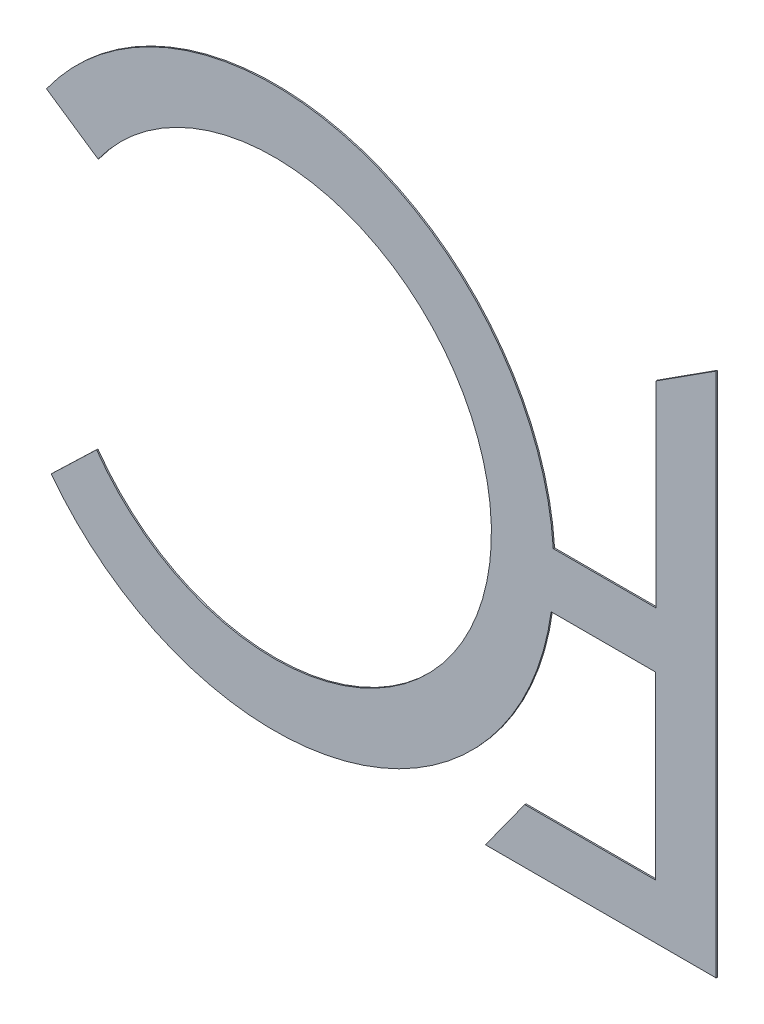
ISO-10303-21;
HEADER;
FILE_DESCRIPTION(('STEP AP214'),'2;1');
FILE_NAME('part.step','',(''),(''),'','','');
FILE_SCHEMA(('AUTOMOTIVE_DESIGN { 1 0 10303 214 1 1 1 1 }'));
ENDSEC;
DATA;
#1=APPLICATION_CONTEXT('core data for automotive mechanical design processes');
#2=APPLICATION_PROTOCOL_DEFINITION('international standard','automotive_design',2000,#1);
#3=PRODUCT_CONTEXT('',#1,'mechanical');
#4=PRODUCT('Part','Part','',(#3));
#5=PRODUCT_RELATED_PRODUCT_CATEGORY('part','',(#4));
#6=PRODUCT_DEFINITION_FORMATION('','',#4);
#7=PRODUCT_DEFINITION_CONTEXT('part definition',#1,'design');
#8=PRODUCT_DEFINITION('design','',#6,#7);
#9=PRODUCT_DEFINITION_SHAPE('','',#8);
#10=(LENGTH_UNIT() NAMED_UNIT(*) SI_UNIT(.MILLI.,.METRE.));
#11=(NAMED_UNIT(*) PLANE_ANGLE_UNIT() SI_UNIT($,.RADIAN.));
#12=(NAMED_UNIT(*) SI_UNIT($,.STERADIAN.) SOLID_ANGLE_UNIT());
#13=UNCERTAINTY_MEASURE_WITH_UNIT(LENGTH_MEASURE(1.E-05),#10,'distance_accuracy_value','');
#14=(GEOMETRIC_REPRESENTATION_CONTEXT(3) GLOBAL_UNCERTAINTY_ASSIGNED_CONTEXT((#13)) GLOBAL_UNIT_ASSIGNED_CONTEXT((#10,
#11,#12)) REPRESENTATION_CONTEXT('',''));
#15=CARTESIAN_POINT('',(0.,0.,0.));
#16=DIRECTION('',(0.,0.,1.));
#17=DIRECTION('',(1.,0.,0.));
#18=AXIS2_PLACEMENT_3D('',#15,#16,#17);
#19=CARTESIAN_POINT('',(3.323569875861,-23.78594416099,0.01));
#20=DIRECTION('',(0.,0.,1.));
#21=DIRECTION('',(1.,0.,0.));
#22=AXIS2_PLACEMENT_3D('',#19,#20,#21);
#23=PLANE('',#22);
#24=DIRECTION('',(-1.,0.,0.));
#25=VECTOR('',#24,1.);
#26=CARTESIAN_POINT('',(4.931794,-23.46396900002,0.01));
#27=LINE('',#26,#25);
#28=CARTESIAN_POINT('',(4.931794,-23.46396900002,0.01));
#29=VERTEX_POINT('',#28);
#30=CARTESIAN_POINT('',(4.146773989456,-23.46396900002,0.01));
#31=VERTEX_POINT('',#30);
#32=EDGE_CURVE('E408',#29,#31,#27,.T.);
#33=ORIENTED_EDGE('',*,*,#32,.T.);
#34=CARTESIAN_POINT('',(2.014560027913,-23.5982645729,0.01));
#35=DIRECTION('',(0.,0.,1.));
#36=DIRECTION('',(1.,0.,0.));
#37=AXIS2_PLACEMENT_3D('',#34,#35,#36);
#38=CIRCLE('',#37,2.136439018248);
#39=CARTESIAN_POINT('',(0.275233743911,-22.35765353132,0.01));
#40=VERTEX_POINT('',#39);
#41=EDGE_CURVE('E11',#31,#40,#38,.T.);
#42=ORIENTED_EDGE('',*,*,#41,.T.);
#43=DIRECTION('',(0.827164937117005,-0.561959221656003,0.));
#44=VECTOR('',#43,1.);
#45=CARTESIAN_POINT('',(0.275233743911,-22.35765353132,0.01));
#46=LINE('',#45,#44);
#47=CARTESIAN_POINT('',(0.669691577678,-22.62564024993,0.01));
#48=VERTEX_POINT('',#47);
#49=EDGE_CURVE('E221',#40,#48,#46,.T.);
#50=ORIENTED_EDGE('',*,*,#49,.T.);
#51=CARTESIAN_POINT('',(2.014560027913,-23.5982645729,0.01));
#52=DIRECTION('',(0.,0.,1.));
#53=DIRECTION('',(1.,0.,0.));
#54=AXIS2_PLACEMENT_3D('',#51,#52,#53);
#55=CIRCLE('',#54,1.659719621524);
#56=CARTESIAN_POINT('',(0.657803128342,-24.55423525108,0.01));
#57=VERTEX_POINT('',#56);
#58=EDGE_CURVE('E228',#57,#48,#55,.T.);
#59=ORIENTED_EDGE('',*,*,#58,.F.);
#60=DIRECTION('',(0.720954387731231,0.692982518402222,0.));
#61=VECTOR('',#60,1.);
#62=CARTESIAN_POINT('',(0.311014787722,-24.88756876249,0.01));
#63=LINE('',#62,#61);
#64=CARTESIAN_POINT('',(0.311014787722,-24.88756876249,0.01));
#65=VERTEX_POINT('',#64);
#66=EDGE_CURVE('E217',#65,#57,#63,.T.);
#67=ORIENTED_EDGE('',*,*,#66,.F.);
#68=CARTESIAN_POINT('',(2.014560027913,-23.5982645729,0.01));
#69=DIRECTION('',(0.,0.,1.));
#70=DIRECTION('',(1.,0.,0.));
#71=AXIS2_PLACEMENT_3D('',#68,#69,#70);
#72=CIRCLE('',#71,2.136439018248);
#73=CARTESIAN_POINT('',(4.13101029711,-23.88982920845,0.01));
#74=VERTEX_POINT('',#73);
#75=EDGE_CURVE('E214',#65,#74,#72,.T.);
#76=ORIENTED_EDGE('',*,*,#75,.T.);
#77=DIRECTION('',(-1.,0.,0.));
#78=VECTOR('',#77,1.);
#79=CARTESIAN_POINT('',(4.927378,-23.88982920845,0.01));
#80=LINE('',#79,#78);
#81=CARTESIAN_POINT('',(4.927378,-23.88982920845,0.01));
#82=VERTEX_POINT('',#81);
#83=EDGE_CURVE('E194',#82,#74,#80,.T.);
#84=ORIENTED_EDGE('',*,*,#83,.F.);
#85=DIRECTION('',(0.,1.,0.));
#86=VECTOR('',#85,1.);
#87=CARTESIAN_POINT('',(4.927378,-25.266255,0.01));
#88=LINE('',#87,#86);
#89=CARTESIAN_POINT('',(4.927378,-25.266255,0.01));
#90=VERTEX_POINT('',#89);
#91=EDGE_CURVE('E154',#90,#82,#88,.T.);
#92=ORIENTED_EDGE('',*,*,#91,.F.);
#93=DIRECTION('',(1.,0.,0.));
#94=VECTOR('',#93,1.);
#95=CARTESIAN_POINT('',(3.929058,-25.266255,0.01));
#96=LINE('',#95,#94);
#97=CARTESIAN_POINT('',(3.929058,-25.266255,0.01));
#98=VERTEX_POINT('',#97);
#99=EDGE_CURVE('E148',#98,#90,#96,.T.);
#100=ORIENTED_EDGE('',*,*,#99,.F.);
#101=DIRECTION('',(0.585300402101743,0.810816526286643,0.));
#102=VECTOR('',#101,1.);
#103=CARTESIAN_POINT('',(3.628518,-25.682593,0.01));
#104=LINE('',#103,#102);
#105=CARTESIAN_POINT('',(3.628518,-25.682593,0.01));
#106=VERTEX_POINT('',#105);
#107=EDGE_CURVE('E151',#106,#98,#104,.T.);
#108=ORIENTED_EDGE('',*,*,#107,.F.);
#109=DIRECTION('',(-1.,0.,0.));
#110=VECTOR('',#109,1.);
#111=CARTESIAN_POINT('',(5.391386,-25.682593,0.01));
#112=LINE('',#111,#110);
#113=CARTESIAN_POINT('',(5.391386,-25.682593,0.01));
#114=VERTEX_POINT('',#113);
#115=EDGE_CURVE('E467',#114,#106,#112,.T.);
#116=ORIENTED_EDGE('',*,*,#115,.F.);
#117=DIRECTION('',(0.,-1.,0.));
#118=VECTOR('',#117,1.);
#119=CARTESIAN_POINT('',(5.391386,-21.666679,0.01));
#120=LINE('',#119,#118);
#121=CARTESIAN_POINT('',(5.391386,-21.666679,0.01));
#122=VERTEX_POINT('',#121);
#123=EDGE_CURVE('E452',#122,#114,#120,.T.);
#124=ORIENTED_EDGE('',*,*,#123,.F.);
#125=DIRECTION('',(-0.841324165024407,-0.540530895829262,0.));
#126=VECTOR('',#125,1.);
#127=CARTESIAN_POINT('',(5.391386,-21.666679,0.01));
#128=LINE('',#127,#126);
#129=CARTESIAN_POINT('',(4.931794,-21.961956,0.01));
#130=VERTEX_POINT('',#129);
#131=EDGE_CURVE('E428',#122,#130,#128,.T.);
#132=ORIENTED_EDGE('',*,*,#131,.T.);
#133=DIRECTION('',(0.,-1.,0.));
#134=VECTOR('',#133,1.);
#135=CARTESIAN_POINT('',(4.931794,-21.961956,0.01));
#136=LINE('',#135,#134);
#137=EDGE_CURVE('E410',#130,#29,#136,.T.);
#138=ORIENTED_EDGE('',*,*,#137,.T.);
#139=EDGE_LOOP('',(#33,#42,#50,#59,#67,#76,#84,#92,#100,#108,#116,#124,#132,#138));
#140=FACE_BOUND('',#139,.T.);
#141=ADVANCED_FACE('F17',(#140),#23,.T.);
#142=CARTESIAN_POINT('',(3.323569875861,-23.78594416099,0.));
#143=DIRECTION('',(0.,0.,1.));
#144=DIRECTION('',(1.,0.,0.));
#145=AXIS2_PLACEMENT_3D('',#142,#143,#144);
#146=PLANE('',#145);
#147=DIRECTION('',(-1.,0.,0.));
#148=VECTOR('',#147,1.);
#149=CARTESIAN_POINT('',(4.931794,-23.46396900002,0.));
#150=LINE('',#149,#148);
#151=CARTESIAN_POINT('',(4.931794,-23.46396900002,0.));
#152=VERTEX_POINT('',#151);
#153=CARTESIAN_POINT('',(4.146773989456,-23.46396900002,0.));
#154=VERTEX_POINT('',#153);
#155=EDGE_CURVE('E417',#152,#154,#150,.T.);
#156=ORIENTED_EDGE('',*,*,#155,.F.);
#157=DIRECTION('',(0.,-1.,0.));
#158=VECTOR('',#157,1.);
#159=CARTESIAN_POINT('',(4.931794,-21.961956,0.));
#160=LINE('',#159,#158);
#161=CARTESIAN_POINT('',(4.931794,-21.961956,0.));
#162=VERTEX_POINT('',#161);
#163=EDGE_CURVE('E437',#162,#152,#160,.T.);
#164=ORIENTED_EDGE('',*,*,#163,.F.);
#165=DIRECTION('',(-0.841324165024407,-0.540530895829262,0.));
#166=VECTOR('',#165,1.);
#167=CARTESIAN_POINT('',(5.391386,-21.666679,0.));
#168=LINE('',#167,#166);
#169=CARTESIAN_POINT('',(5.391386,-21.666679,0.));
#170=VERTEX_POINT('',#169);
#171=EDGE_CURVE('E438',#170,#162,#168,.T.);
#172=ORIENTED_EDGE('',*,*,#171,.F.);
#173=DIRECTION('',(0.,-1.,0.));
#174=VECTOR('',#173,1.);
#175=CARTESIAN_POINT('',(5.391386,-21.666679,0.));
#176=LINE('',#175,#174);
#177=CARTESIAN_POINT('',(5.391386,-25.682593,0.));
#178=VERTEX_POINT('',#177);
#179=EDGE_CURVE('E464',#170,#178,#176,.T.);
#180=ORIENTED_EDGE('',*,*,#179,.T.);
#181=DIRECTION('',(-1.,0.,0.));
#182=VECTOR('',#181,1.);
#183=CARTESIAN_POINT('',(5.391386,-25.682593,0.));
#184=LINE('',#183,#182);
#185=CARTESIAN_POINT('',(3.628518,-25.682593,0.));
#186=VERTEX_POINT('',#185);
#187=EDGE_CURVE('E176',#178,#186,#184,.T.);
#188=ORIENTED_EDGE('',*,*,#187,.T.);
#189=DIRECTION('',(0.585300402101743,0.810816526286643,0.));
#190=VECTOR('',#189,1.);
#191=CARTESIAN_POINT('',(3.628518,-25.682593,0.));
#192=LINE('',#191,#190);
#193=CARTESIAN_POINT('',(3.929058,-25.266255,0.));
#194=VERTEX_POINT('',#193);
#195=EDGE_CURVE('E160',#186,#194,#192,.T.);
#196=ORIENTED_EDGE('',*,*,#195,.T.);
#197=DIRECTION('',(1.,0.,0.));
#198=VECTOR('',#197,1.);
#199=CARTESIAN_POINT('',(3.929058,-25.266255,0.));
#200=LINE('',#199,#198);
#201=CARTESIAN_POINT('',(4.927378,-25.266255,0.));
#202=VERTEX_POINT('',#201);
#203=EDGE_CURVE('E166',#194,#202,#200,.T.);
#204=ORIENTED_EDGE('',*,*,#203,.T.);
#205=DIRECTION('',(0.,1.,0.));
#206=VECTOR('',#205,1.);
#207=CARTESIAN_POINT('',(4.927378,-25.266255,0.));
#208=LINE('',#207,#206);
#209=CARTESIAN_POINT('',(4.927378,-23.88982920845,0.));
#210=VERTEX_POINT('',#209);
#211=EDGE_CURVE('E190',#202,#210,#208,.T.);
#212=ORIENTED_EDGE('',*,*,#211,.T.);
#213=DIRECTION('',(-1.,0.,0.));
#214=VECTOR('',#213,1.);
#215=CARTESIAN_POINT('',(4.927378,-23.88982920845,0.));
#216=LINE('',#215,#214);
#217=CARTESIAN_POINT('',(4.13101029711,-23.88982920845,0.));
#218=VERTEX_POINT('',#217);
#219=EDGE_CURVE('E203',#210,#218,#216,.T.);
#220=ORIENTED_EDGE('',*,*,#219,.T.);
#221=CARTESIAN_POINT('',(2.014560027913,-23.5982645729,0.));
#222=DIRECTION('',(0.,0.,1.));
#223=DIRECTION('',(1.,0.,0.));
#224=AXIS2_PLACEMENT_3D('',#221,#222,#223);
#225=CIRCLE('',#224,2.136439018248);
#226=CARTESIAN_POINT('',(0.311014787722,-24.88756876249,0.));
#227=VERTEX_POINT('',#226);
#228=EDGE_CURVE('E211',#227,#218,#225,.T.);
#229=ORIENTED_EDGE('',*,*,#228,.F.);
#230=DIRECTION('',(0.720954387731231,0.692982518402222,0.));
#231=VECTOR('',#230,1.);
#232=CARTESIAN_POINT('',(0.311014787722,-24.88756876249,0.));
#233=LINE('',#232,#231);
#234=CARTESIAN_POINT('',(0.657803128342,-24.55423525108,0.));
#235=VERTEX_POINT('',#234);
#236=EDGE_CURVE('E227',#227,#235,#233,.T.);
#237=ORIENTED_EDGE('',*,*,#236,.T.);
#238=CARTESIAN_POINT('',(2.014560027913,-23.5982645729,0.));
#239=DIRECTION('',(0.,0.,1.));
#240=DIRECTION('',(1.,0.,0.));
#241=AXIS2_PLACEMENT_3D('',#238,#239,#240);
#242=CIRCLE('',#241,1.659719621524);
#243=CARTESIAN_POINT('',(0.669691577678,-22.62564024993,0.));
#244=VERTEX_POINT('',#243);
#245=EDGE_CURVE('E236',#235,#244,#242,.T.);
#246=ORIENTED_EDGE('',*,*,#245,.T.);
#247=DIRECTION('',(0.827164937117005,-0.561959221656003,0.));
#248=VECTOR('',#247,1.);
#249=CARTESIAN_POINT('',(0.275233743911,-22.35765353132,0.));
#250=LINE('',#249,#248);
#251=CARTESIAN_POINT('',(0.275233743911,-22.35765353132,0.));
#252=VERTEX_POINT('',#251);
#253=EDGE_CURVE('E218',#252,#244,#250,.T.);
#254=ORIENTED_EDGE('',*,*,#253,.F.);
#255=CARTESIAN_POINT('',(2.014560027913,-23.5982645729,0.));
#256=DIRECTION('',(0.,0.,1.));
#257=DIRECTION('',(1.,0.,0.));
#258=AXIS2_PLACEMENT_3D('',#255,#256,#257);
#259=CIRCLE('',#258,2.136439018248);
#260=EDGE_CURVE('E25',#154,#252,#259,.T.);
#261=ORIENTED_EDGE('',*,*,#260,.F.);
#262=EDGE_LOOP('',(#156,#164,#172,#180,#188,#196,#204,#212,#220,#229,#237,#246,#254,#261));
#263=FACE_BOUND('',#262,.T.);
#264=ADVANCED_FACE('F291',(#263),#146,.F.);
#265=CARTESIAN_POINT('',(2.014560027913,-23.5982645729,0.));
#266=DIRECTION('',(0.,0.,-1.));
#267=DIRECTION('',(1.,0.,0.));
#268=AXIS2_PLACEMENT_3D('',#265,#266,#267);
#269=CYLINDRICAL_SURFACE('',#268,2.136439018248);
#270=DIRECTION('',(0.,0.,1.));
#271=VECTOR('',#270,1.);
#272=CARTESIAN_POINT('',(4.146773989456,-23.46396900002,0.));
#273=LINE('',#272,#271);
#274=EDGE_CURVE('E405',#154,#31,#273,.T.);
#275=ORIENTED_EDGE('',*,*,#274,.F.);
#276=ORIENTED_EDGE('',*,*,#260,.T.);
#277=DIRECTION('',(0.,0.,1.));
#278=VECTOR('',#277,1.);
#279=CARTESIAN_POINT('',(0.275233743911,-22.35765353132,0.));
#280=LINE('',#279,#278);
#281=EDGE_CURVE('E222',#252,#40,#280,.T.);
#282=ORIENTED_EDGE('',*,*,#281,.T.);
#283=ORIENTED_EDGE('',*,*,#41,.F.);
#284=EDGE_LOOP('',(#275,#276,#282,#283));
#285=FACE_BOUND('',#284,.T.);
#286=ADVANCED_FACE('F296',(#285),#269,.T.);
#287=CARTESIAN_POINT('',(0.275233743911,-22.35765353132,0.));
#288=DIRECTION('',(0.561959221656003,0.827164937117005,0.));
#289=DIRECTION('',(0.,0.,-1.));
#290=AXIS2_PLACEMENT_3D('',#287,#288,#289);
#291=PLANE('',#290);
#292=ORIENTED_EDGE('',*,*,#281,.F.);
#293=ORIENTED_EDGE('',*,*,#253,.T.);
#294=DIRECTION('',(0.,0.,1.));
#295=VECTOR('',#294,1.);
#296=CARTESIAN_POINT('',(0.669691577678,-22.62564024993,0.));
#297=LINE('',#296,#295);
#298=EDGE_CURVE('E232',#244,#48,#297,.T.);
#299=ORIENTED_EDGE('',*,*,#298,.T.);
#300=ORIENTED_EDGE('',*,*,#49,.F.);
#301=EDGE_LOOP('',(#292,#293,#299,#300));
#302=FACE_BOUND('',#301,.T.);
#303=ADVANCED_FACE('F322',(#302),#291,.F.);
#304=CARTESIAN_POINT('',(2.014560027913,-23.5982645729,0.));
#305=DIRECTION('',(0.,0.,-1.));
#306=DIRECTION('',(1.,0.,0.));
#307=AXIS2_PLACEMENT_3D('',#304,#305,#306);
#308=CYLINDRICAL_SURFACE('',#307,1.659719621524);
#309=DIRECTION('',(0.,0.,1.));
#310=VECTOR('',#309,1.);
#311=CARTESIAN_POINT('',(0.657803128342,-24.55423525108,0.));
#312=LINE('',#311,#310);
#313=EDGE_CURVE('E223',#235,#57,#312,.T.);
#314=ORIENTED_EDGE('',*,*,#313,.T.);
#315=ORIENTED_EDGE('',*,*,#58,.T.);
#316=ORIENTED_EDGE('',*,*,#298,.F.);
#317=ORIENTED_EDGE('',*,*,#245,.F.);
#318=EDGE_LOOP('',(#314,#315,#316,#317));
#319=FACE_BOUND('',#318,.T.);
#320=ADVANCED_FACE('F253',(#319),#308,.F.);
#321=CARTESIAN_POINT('',(0.311014787722,-24.88756876249,0.));
#322=DIRECTION('',(-0.692982518402222,0.720954387731231,0.));
#323=DIRECTION('',(0.,0.,1.));
#324=AXIS2_PLACEMENT_3D('',#321,#322,#323);
#325=PLANE('',#324);
#326=DIRECTION('',(0.,0.,1.));
#327=VECTOR('',#326,1.);
#328=CARTESIAN_POINT('',(0.311014787722,-24.88756876249,0.));
#329=LINE('',#328,#327);
#330=EDGE_CURVE('E207',#227,#65,#329,.T.);
#331=ORIENTED_EDGE('',*,*,#330,.T.);
#332=ORIENTED_EDGE('',*,*,#66,.T.);
#333=ORIENTED_EDGE('',*,*,#313,.F.);
#334=ORIENTED_EDGE('',*,*,#236,.F.);
#335=EDGE_LOOP('',(#331,#332,#333,#334));
#336=FACE_BOUND('',#335,.T.);
#337=ADVANCED_FACE('F247',(#336),#325,.T.);
#338=CARTESIAN_POINT('',(2.014560027913,-23.5982645729,0.));
#339=DIRECTION('',(0.,0.,-1.));
#340=DIRECTION('',(1.,0.,0.));
#341=AXIS2_PLACEMENT_3D('',#338,#339,#340);
#342=CYLINDRICAL_SURFACE('',#341,2.136439018248);
#343=ORIENTED_EDGE('',*,*,#330,.F.);
#344=ORIENTED_EDGE('',*,*,#228,.T.);
#345=DIRECTION('',(0.,0.,1.));
#346=VECTOR('',#345,1.);
#347=CARTESIAN_POINT('',(4.13101029711,-23.88982920845,0.));
#348=LINE('',#347,#346);
#349=EDGE_CURVE('E199',#218,#74,#348,.T.);
#350=ORIENTED_EDGE('',*,*,#349,.T.);
#351=ORIENTED_EDGE('',*,*,#75,.F.);
#352=EDGE_LOOP('',(#343,#344,#350,#351));
#353=FACE_BOUND('',#352,.T.);
#354=ADVANCED_FACE('F252',(#353),#342,.T.);
#355=CARTESIAN_POINT('',(4.927378,-23.88982920845,0.));
#356=DIRECTION('',(0.,-1.,0.));
#357=DIRECTION('',(0.,0.,-1.));
#358=AXIS2_PLACEMENT_3D('',#355,#356,#357);
#359=PLANE('',#358);
#360=DIRECTION('',(0.,0.,1.));
#361=VECTOR('',#360,1.);
#362=CARTESIAN_POINT('',(4.927378,-23.88982920845,0.));
#363=LINE('',#362,#361);
#364=EDGE_CURVE('E195',#210,#82,#363,.T.);
#365=ORIENTED_EDGE('',*,*,#364,.T.);
#366=ORIENTED_EDGE('',*,*,#83,.T.);
#367=ORIENTED_EDGE('',*,*,#349,.F.);
#368=ORIENTED_EDGE('',*,*,#219,.F.);
#369=EDGE_LOOP('',(#365,#366,#367,#368));
#370=FACE_BOUND('',#369,.T.);
#371=ADVANCED_FACE('F345',(#370),#359,.T.);
#372=CARTESIAN_POINT('',(4.927378,-25.266255,0.));
#373=DIRECTION('',(-1.,0.,0.));
#374=DIRECTION('',(0.,0.,1.));
#375=AXIS2_PLACEMENT_3D('',#372,#373,#374);
#376=PLANE('',#375);
#377=DIRECTION('',(0.,0.,1.));
#378=VECTOR('',#377,1.);
#379=CARTESIAN_POINT('',(4.927378,-25.266255,0.));
#380=LINE('',#379,#378);
#381=EDGE_CURVE('E159',#202,#90,#380,.T.);
#382=ORIENTED_EDGE('',*,*,#381,.T.);
#383=ORIENTED_EDGE('',*,*,#91,.T.);
#384=ORIENTED_EDGE('',*,*,#364,.F.);
#385=ORIENTED_EDGE('',*,*,#211,.F.);
#386=EDGE_LOOP('',(#382,#383,#384,#385));
#387=FACE_BOUND('',#386,.T.);
#388=ADVANCED_FACE('F337',(#387),#376,.T.);
#389=CARTESIAN_POINT('',(3.929058,-25.266255,0.));
#390=DIRECTION('',(0.,1.,0.));
#391=DIRECTION('',(1.,0.,0.));
#392=AXIS2_PLACEMENT_3D('',#389,#390,#391);
#393=PLANE('',#392);
#394=DIRECTION('',(0.,0.,1.));
#395=VECTOR('',#394,1.);
#396=CARTESIAN_POINT('',(3.929058,-25.266255,0.));
#397=LINE('',#396,#395);
#398=EDGE_CURVE('E163',#194,#98,#397,.T.);
#399=ORIENTED_EDGE('',*,*,#398,.T.);
#400=ORIENTED_EDGE('',*,*,#99,.T.);
#401=ORIENTED_EDGE('',*,*,#381,.F.);
#402=ORIENTED_EDGE('',*,*,#203,.F.);
#403=EDGE_LOOP('',(#399,#400,#401,#402));
#404=FACE_BOUND('',#403,.T.);
#405=ADVANCED_FACE('F164',(#404),#393,.T.);
#406=CARTESIAN_POINT('',(3.628518,-25.682593,0.));
#407=DIRECTION('',(-0.810816526286643,0.585300402101742,0.));
#408=DIRECTION('',(0.,0.,1.));
#409=AXIS2_PLACEMENT_3D('',#406,#407,#408);
#410=PLANE('',#409);
#411=DIRECTION('',(0.,0.,1.));
#412=VECTOR('',#411,1.);
#413=CARTESIAN_POINT('',(3.628518,-25.682593,0.));
#414=LINE('',#413,#412);
#415=EDGE_CURVE('E173',#186,#106,#414,.T.);
#416=ORIENTED_EDGE('',*,*,#415,.T.);
#417=ORIENTED_EDGE('',*,*,#107,.T.);
#418=ORIENTED_EDGE('',*,*,#398,.F.);
#419=ORIENTED_EDGE('',*,*,#195,.F.);
#420=EDGE_LOOP('',(#416,#417,#418,#419));
#421=FACE_BOUND('',#420,.T.);
#422=ADVANCED_FACE('F171',(#421),#410,.T.);
#423=CARTESIAN_POINT('',(5.391386,-25.682593,0.));
#424=DIRECTION('',(0.,-1.,0.));
#425=DIRECTION('',(0.,0.,-1.));
#426=AXIS2_PLACEMENT_3D('',#423,#424,#425);
#427=PLANE('',#426);
#428=DIRECTION('',(0.,0.,1.));
#429=VECTOR('',#428,1.);
#430=CARTESIAN_POINT('',(5.391386,-25.682593,0.));
#431=LINE('',#430,#429);
#432=EDGE_CURVE('E456',#178,#114,#431,.T.);
#433=ORIENTED_EDGE('',*,*,#432,.T.);
#434=ORIENTED_EDGE('',*,*,#115,.T.);
#435=ORIENTED_EDGE('',*,*,#415,.F.);
#436=ORIENTED_EDGE('',*,*,#187,.F.);
#437=EDGE_LOOP('',(#433,#434,#435,#436));
#438=FACE_BOUND('',#437,.T.);
#439=ADVANCED_FACE('F276',(#438),#427,.T.);
#440=CARTESIAN_POINT('',(5.391386,-21.666679,0.));
#441=DIRECTION('',(1.,0.,0.));
#442=DIRECTION('',(0.,1.,0.));
#443=AXIS2_PLACEMENT_3D('',#440,#441,#442);
#444=PLANE('',#443);
#445=DIRECTION('',(0.,0.,1.));
#446=VECTOR('',#445,1.);
#447=CARTESIAN_POINT('',(5.391386,-21.666679,0.));
#448=LINE('',#447,#446);
#449=EDGE_CURVE('E441',#170,#122,#448,.T.);
#450=ORIENTED_EDGE('',*,*,#449,.T.);
#451=ORIENTED_EDGE('',*,*,#123,.T.);
#452=ORIENTED_EDGE('',*,*,#432,.F.);
#453=ORIENTED_EDGE('',*,*,#179,.F.);
#454=EDGE_LOOP('',(#450,#451,#452,#453));
#455=FACE_BOUND('',#454,.T.);
#456=ADVANCED_FACE('F306',(#455),#444,.T.);
#457=CARTESIAN_POINT('',(5.391386,-21.666679,0.));
#458=DIRECTION('',(0.540530895829262,-0.841324165024407,0.));
#459=DIRECTION('',(0.,0.,-1.));
#460=AXIS2_PLACEMENT_3D('',#457,#458,#459);
#461=PLANE('',#460);
#462=ORIENTED_EDGE('',*,*,#449,.F.);
#463=ORIENTED_EDGE('',*,*,#171,.T.);
#464=DIRECTION('',(0.,0.,1.));
#465=VECTOR('',#464,1.);
#466=CARTESIAN_POINT('',(4.931794,-21.961956,0.));
#467=LINE('',#466,#465);
#468=EDGE_CURVE('E414',#162,#130,#467,.T.);
#469=ORIENTED_EDGE('',*,*,#468,.T.);
#470=ORIENTED_EDGE('',*,*,#131,.F.);
#471=EDGE_LOOP('',(#462,#463,#469,#470));
#472=FACE_BOUND('',#471,.T.);
#473=ADVANCED_FACE('F285',(#472),#461,.F.);
#474=CARTESIAN_POINT('',(4.931794,-21.961956,0.));
#475=DIRECTION('',(1.,0.,0.));
#476=DIRECTION('',(0.,1.,0.));
#477=AXIS2_PLACEMENT_3D('',#474,#475,#476);
#478=PLANE('',#477);
#479=ORIENTED_EDGE('',*,*,#468,.F.);
#480=ORIENTED_EDGE('',*,*,#163,.T.);
#481=DIRECTION('',(0.,0.,1.));
#482=VECTOR('',#481,1.);
#483=CARTESIAN_POINT('',(4.931794,-23.46396900002,0.));
#484=LINE('',#483,#482);
#485=EDGE_CURVE('E424',#152,#29,#484,.T.);
#486=ORIENTED_EDGE('',*,*,#485,.T.);
#487=ORIENTED_EDGE('',*,*,#137,.F.);
#488=EDGE_LOOP('',(#479,#480,#486,#487));
#489=FACE_BOUND('',#488,.T.);
#490=ADVANCED_FACE('F266',(#489),#478,.F.);
#491=CARTESIAN_POINT('',(4.931794,-23.46396900002,0.));
#492=DIRECTION('',(0.,-1.,0.));
#493=DIRECTION('',(0.,0.,-1.));
#494=AXIS2_PLACEMENT_3D('',#491,#492,#493);
#495=PLANE('',#494);
#496=ORIENTED_EDGE('',*,*,#485,.F.);
#497=ORIENTED_EDGE('',*,*,#155,.T.);
#498=ORIENTED_EDGE('',*,*,#274,.T.);
#499=ORIENTED_EDGE('',*,*,#32,.F.);
#500=EDGE_LOOP('',(#496,#497,#498,#499));
#501=FACE_BOUND('',#500,.T.);
#502=ADVANCED_FACE('F261',(#501),#495,.F.);
#503=CLOSED_SHELL('',(#141,#264,#286,#303,#320,#337,#354,#371,#388,#405,#422,#439,#456,#473,
#490,#502));
#504=MANIFOLD_SOLID_BREP('B1',#503);
#505=ADVANCED_BREP_SHAPE_REPRESENTATION('',(#18,#504),#14);
#506=SHAPE_DEFINITION_REPRESENTATION(#9,#505);
ENDSEC;
END-ISO-10303-21;
